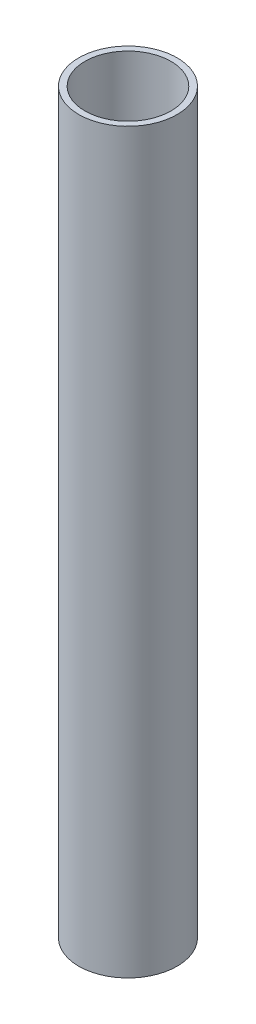
ISO-10303-21;
HEADER;
FILE_DESCRIPTION(('STEP AP214'),'2;1');
FILE_NAME('part.step','',(''),(''),'','','');
FILE_SCHEMA(('AUTOMOTIVE_DESIGN { 1 0 10303 214 1 1 1 1 }'));
ENDSEC;
DATA;
#1=APPLICATION_CONTEXT('core data for automotive mechanical design processes');
#2=APPLICATION_PROTOCOL_DEFINITION('international standard','automotive_design',2000,#1);
#3=PRODUCT_CONTEXT('',#1,'mechanical');
#4=PRODUCT('Part','Part','',(#3));
#5=PRODUCT_RELATED_PRODUCT_CATEGORY('part','',(#4));
#6=PRODUCT_DEFINITION_FORMATION('','',#4);
#7=PRODUCT_DEFINITION_CONTEXT('part definition',#1,'design');
#8=PRODUCT_DEFINITION('design','',#6,#7);
#9=PRODUCT_DEFINITION_SHAPE('','',#8);
#10=(LENGTH_UNIT() NAMED_UNIT(*) SI_UNIT(.MILLI.,.METRE.));
#11=(NAMED_UNIT(*) PLANE_ANGLE_UNIT() SI_UNIT($,.RADIAN.));
#12=(NAMED_UNIT(*) SI_UNIT($,.STERADIAN.) SOLID_ANGLE_UNIT());
#13=UNCERTAINTY_MEASURE_WITH_UNIT(LENGTH_MEASURE(1.E-05),#10,'distance_accuracy_value','');
#14=(GEOMETRIC_REPRESENTATION_CONTEXT(3) GLOBAL_UNCERTAINTY_ASSIGNED_CONTEXT((#13)) GLOBAL_UNIT_ASSIGNED_CONTEXT((#10,
#11,#12)) REPRESENTATION_CONTEXT('',''));
#15=CARTESIAN_POINT('',(0.,0.,0.));
#16=DIRECTION('',(0.,0.,1.));
#17=DIRECTION('',(1.,0.,0.));
#18=AXIS2_PLACEMENT_3D('',#15,#16,#17);
#19=CARTESIAN_POINT('',(0.,60.,0.));
#20=DIRECTION('',(0.,1.,0.));
#21=DIRECTION('',(0.,0.,1.));
#22=AXIS2_PLACEMENT_3D('',#19,#20,#21);
#23=PLANE('',#22);
#24=CARTESIAN_POINT('',(0.,60.,0.));
#25=DIRECTION('',(0.,1.,0.));
#26=DIRECTION('',(0.,0.,1.));
#27=AXIS2_PLACEMENT_3D('',#24,#25,#26);
#28=CIRCLE('',#27,4.);
#29=CARTESIAN_POINT('',(0.,60.,4.));
#30=VERTEX_POINT('',#29);
#31=EDGE_CURVE('E10',#30,#30,#28,.T.);
#32=ORIENTED_EDGE('',*,*,#31,.T.);
#33=EDGE_LOOP('',(#32));
#34=FACE_BOUND('',#33,.T.);
#35=CARTESIAN_POINT('',(0.,60.,0.));
#36=DIRECTION('',(0.,1.,0.));
#37=DIRECTION('',(0.,0.,1.));
#38=AXIS2_PLACEMENT_3D('',#35,#36,#37);
#39=CIRCLE('',#38,3.5);
#40=CARTESIAN_POINT('',(0.,60.,3.5));
#41=VERTEX_POINT('',#40);
#42=EDGE_CURVE('E41',#41,#41,#39,.T.);
#43=ORIENTED_EDGE('',*,*,#42,.F.);
#44=EDGE_LOOP('',(#43));
#45=FACE_BOUND('',#44,.T.);
#46=ADVANCED_FACE('F30',(#34,#45),#23,.T.);
#47=CARTESIAN_POINT('',(0.,0.,0.));
#48=DIRECTION('',(0.,1.,0.));
#49=DIRECTION('',(0.,0.,1.));
#50=AXIS2_PLACEMENT_3D('',#47,#48,#49);
#51=PLANE('',#50);
#52=CARTESIAN_POINT('',(0.,0.,0.));
#53=DIRECTION('',(0.,1.,0.));
#54=DIRECTION('',(0.,0.,1.));
#55=AXIS2_PLACEMENT_3D('',#52,#53,#54);
#56=CIRCLE('',#55,4.);
#57=CARTESIAN_POINT('',(0.,0.,4.));
#58=VERTEX_POINT('',#57);
#59=EDGE_CURVE('E34',#58,#58,#56,.T.);
#60=ORIENTED_EDGE('',*,*,#59,.F.);
#61=EDGE_LOOP('',(#60));
#62=FACE_BOUND('',#61,.T.);
#63=CARTESIAN_POINT('',(0.,0.,0.));
#64=DIRECTION('',(0.,1.,0.));
#65=DIRECTION('',(0.,0.,1.));
#66=AXIS2_PLACEMENT_3D('',#63,#64,#65);
#67=CIRCLE('',#66,3.5);
#68=CARTESIAN_POINT('',(0.,0.,3.5));
#69=VERTEX_POINT('',#68);
#70=EDGE_CURVE('E43',#69,#69,#67,.T.);
#71=ORIENTED_EDGE('',*,*,#70,.T.);
#72=EDGE_LOOP('',(#71));
#73=FACE_BOUND('',#72,.T.);
#74=ADVANCED_FACE('F53',(#62,#73),#51,.F.);
#75=CARTESIAN_POINT('',(0.,60.,0.));
#76=DIRECTION('',(0.,-1.,0.));
#77=DIRECTION('',(0.,0.,-1.));
#78=AXIS2_PLACEMENT_3D('',#75,#76,#77);
#79=CYLINDRICAL_SURFACE('',#78,4.);
#80=ORIENTED_EDGE('',*,*,#31,.F.);
#81=EDGE_LOOP('',(#80));
#82=FACE_BOUND('',#81,.T.);
#83=ORIENTED_EDGE('',*,*,#59,.T.);
#84=EDGE_LOOP('',(#83));
#85=FACE_BOUND('',#84,.T.);
#86=ADVANCED_FACE('F32',(#82,#85),#79,.T.);
#87=CARTESIAN_POINT('',(0.,60.,0.));
#88=DIRECTION('',(0.,-1.,0.));
#89=DIRECTION('',(0.,0.,-1.));
#90=AXIS2_PLACEMENT_3D('',#87,#88,#89);
#91=CYLINDRICAL_SURFACE('',#90,3.5);
#92=ORIENTED_EDGE('',*,*,#42,.T.);
#93=EDGE_LOOP('',(#92));
#94=FACE_BOUND('',#93,.T.);
#95=ORIENTED_EDGE('',*,*,#70,.F.);
#96=EDGE_LOOP('',(#95));
#97=FACE_BOUND('',#96,.T.);
#98=ADVANCED_FACE('F49',(#94,#97),#91,.F.);
#99=CLOSED_SHELL('',(#46,#74,#86,#98));
#100=MANIFOLD_SOLID_BREP('B2',#99);
#101=ADVANCED_BREP_SHAPE_REPRESENTATION('',(#18,#100),#14);
#102=SHAPE_DEFINITION_REPRESENTATION(#9,#101);
ENDSEC;
END-ISO-10303-21;
